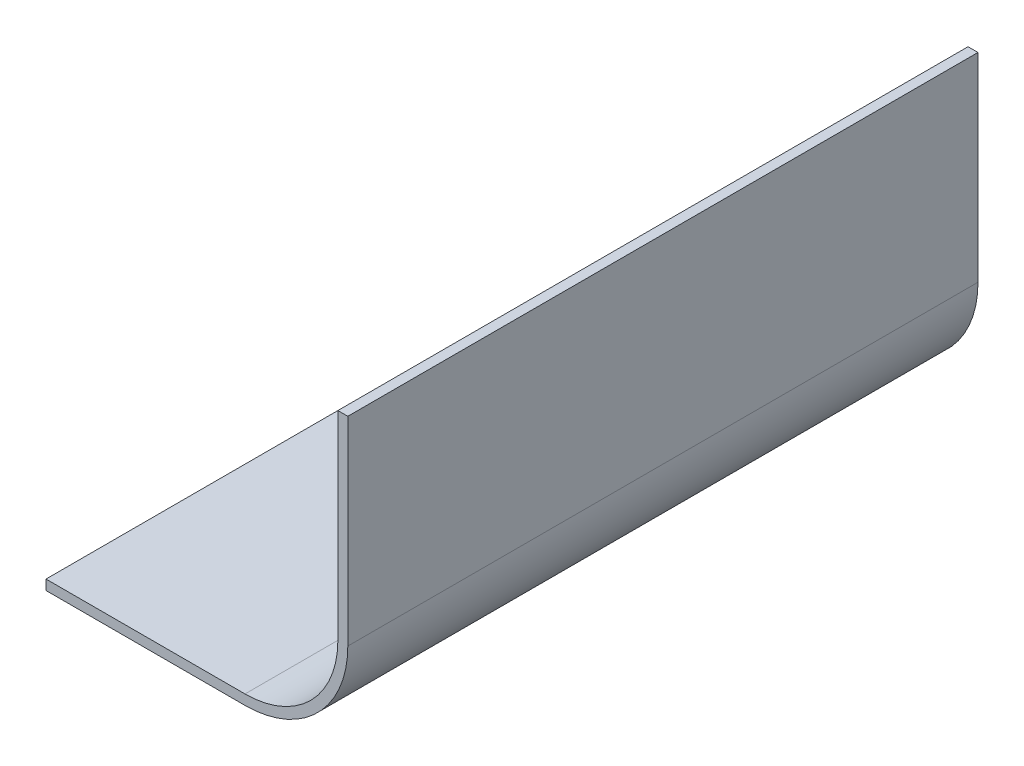
ISO-10303-21;
HEADER;
FILE_DESCRIPTION(('STEP AP214'),'2;1');
FILE_NAME('part.step','',(''),(''),'','','');
FILE_SCHEMA(('AUTOMOTIVE_DESIGN { 1 0 10303 214 1 1 1 1 }'));
ENDSEC;
DATA;
#1=APPLICATION_CONTEXT('core data for automotive mechanical design processes');
#2=APPLICATION_PROTOCOL_DEFINITION('international standard','automotive_design',2000,#1);
#3=PRODUCT_CONTEXT('',#1,'mechanical');
#4=PRODUCT('Part','Part','',(#3));
#5=PRODUCT_RELATED_PRODUCT_CATEGORY('part','',(#4));
#6=PRODUCT_DEFINITION_FORMATION('','',#4);
#7=PRODUCT_DEFINITION_CONTEXT('part definition',#1,'design');
#8=PRODUCT_DEFINITION('design','',#6,#7);
#9=PRODUCT_DEFINITION_SHAPE('','',#8);
#10=(LENGTH_UNIT() NAMED_UNIT(*) SI_UNIT(.MILLI.,.METRE.));
#11=(NAMED_UNIT(*) PLANE_ANGLE_UNIT() SI_UNIT($,.RADIAN.));
#12=(NAMED_UNIT(*) SI_UNIT($,.STERADIAN.) SOLID_ANGLE_UNIT());
#13=UNCERTAINTY_MEASURE_WITH_UNIT(LENGTH_MEASURE(1.E-05),#10,'distance_accuracy_value','');
#14=(GEOMETRIC_REPRESENTATION_CONTEXT(3) GLOBAL_UNCERTAINTY_ASSIGNED_CONTEXT((#13)) GLOBAL_UNIT_ASSIGNED_CONTEXT((#10,
#11,#12)) REPRESENTATION_CONTEXT('',''));
#15=CARTESIAN_POINT('',(0.,0.,0.));
#16=DIRECTION('',(0.,0.,1.));
#17=DIRECTION('',(1.,0.,0.));
#18=AXIS2_PLACEMENT_3D('',#15,#16,#17);
#19=CARTESIAN_POINT('',(318.230095586367,329.772792200192,279.007812812781));
#20=DIRECTION('',(0.,-1.,0.));
#21=DIRECTION('',(0.,0.,0.999999999999999));
#22=AXIS2_PLACEMENT_3D('',#19,#20,#21);
#23=PLANE('',#22);
#24=DIRECTION('',(0.,0.,0.999999999999999));
#25=VECTOR('',#24,1.);
#26=CARTESIAN_POINT('',(318.230095586367,329.772792200192,279.007812812781));
#27=LINE('',#26,#25);
#28=CARTESIAN_POINT('',(318.230095586367,329.772792200191,285.00781281278));
#29=VERTEX_POINT('',#28);
#30=CARTESIAN_POINT('',(318.230095586367,329.772792200191,475.00781281278));
#31=VERTEX_POINT('',#30);
#32=EDGE_CURVE('E227',#29,#31,#27,.T.);
#33=ORIENTED_EDGE('',*,*,#32,.F.);
#34=DIRECTION('',(-0.999999999999998,0.,0.));
#35=VECTOR('',#34,1.);
#36=CARTESIAN_POINT('',(227.230095586367,329.772792200192,285.007812812782));
#37=LINE('',#36,#35);
#38=CARTESIAN_POINT('',(315.230095586367,329.772792200191,285.00781281278));
#39=VERTEX_POINT('',#38);
#40=EDGE_CURVE('E409',#29,#39,#37,.T.);
#41=ORIENTED_EDGE('',*,*,#40,.T.);
#42=DIRECTION('',(0.,0.,0.999999999999999));
#43=VECTOR('',#42,1.);
#44=CARTESIAN_POINT('',(315.230095586366,329.772792200192,279.007812812781));
#45=LINE('',#44,#43);
#46=CARTESIAN_POINT('',(315.230095586367,329.772792200192,475.00781281278));
#47=VERTEX_POINT('',#46);
#48=EDGE_CURVE('E245',#39,#47,#45,.T.);
#49=ORIENTED_EDGE('',*,*,#48,.T.);
#50=DIRECTION('',(-0.999999999999998,0.,0.));
#51=VECTOR('',#50,1.);
#52=CARTESIAN_POINT('',(318.230095586367,329.772792200191,475.00781281278));
#53=LINE('',#52,#51);
#54=EDGE_CURVE('E243',#31,#47,#53,.T.);
#55=ORIENTED_EDGE('',*,*,#54,.F.);
#56=EDGE_LOOP('',(#33,#41,#49,#55));
#57=FACE_BOUND('',#56,.T.);
#58=ADVANCED_FACE('F185',(#57),#23,.F.);
#59=CARTESIAN_POINT('',(287.230095586367,241.772792200192,279.007812812781));
#60=DIRECTION('',(0.,1.,0.));
#61=DIRECTION('',(0.,0.,0.999999999999999));
#62=AXIS2_PLACEMENT_3D('',#59,#60,#61);
#63=PLANE('',#62);
#64=DIRECTION('',(0.,0.,0.999999999999999));
#65=VECTOR('',#64,1.);
#66=CARTESIAN_POINT('',(287.230095586367,241.772792200192,279.007812812781));
#67=LINE('',#66,#65);
#68=CARTESIAN_POINT('',(287.230095586367,241.772792200192,285.007812812781));
#69=VERTEX_POINT('',#68);
#70=CARTESIAN_POINT('',(287.230095586367,241.772792200191,475.007812812781));
#71=VERTEX_POINT('',#70);
#72=EDGE_CURVE('E208',#69,#71,#67,.T.);
#73=ORIENTED_EDGE('',*,*,#72,.F.);
#74=DIRECTION('',(-0.999999999999998,0.,0.));
#75=VECTOR('',#74,1.);
#76=CARTESIAN_POINT('',(287.230095586367,241.772792200192,285.007812812781));
#77=LINE('',#76,#75);
#78=CARTESIAN_POINT('',(227.230095586367,241.772792200193,285.007812812781));
#79=VERTEX_POINT('',#78);
#80=EDGE_CURVE('E319',#69,#79,#77,.T.);
#81=ORIENTED_EDGE('',*,*,#80,.T.);
#82=DIRECTION('',(0.,0.,-0.999999999999999));
#83=VECTOR('',#82,1.);
#84=CARTESIAN_POINT('',(227.230095586367,241.772792200193,279.007812812781));
#85=LINE('',#84,#83);
#86=CARTESIAN_POINT('',(227.230095586367,241.772792200192,475.007812812781));
#87=VERTEX_POINT('',#86);
#88=EDGE_CURVE('E253',#87,#79,#85,.T.);
#89=ORIENTED_EDGE('',*,*,#88,.F.);
#90=DIRECTION('',(0.999999999999998,0.,0.));
#91=VECTOR('',#90,1.);
#92=CARTESIAN_POINT('',(287.230095586367,241.772792200191,475.007812812781));
#93=LINE('',#92,#91);
#94=EDGE_CURVE('E277',#71,#87,#93,.F.);
#95=ORIENTED_EDGE('',*,*,#94,.F.);
#96=EDGE_LOOP('',(#73,#81,#89,#95));
#97=FACE_BOUND('',#96,.T.);
#98=ADVANCED_FACE('F326',(#97),#63,.T.);
#99=CARTESIAN_POINT('',(287.230095586367,269.772792200192,279.007812812781));
#100=DIRECTION('',(0.,0.,0.999999999999999));
#101=DIRECTION('',(0.999999999999998,0.,0.));
#102=AXIS2_PLACEMENT_3D('',#99,#100,#101);
#103=CYLINDRICAL_SURFACE('',#102,28.);
#104=DIRECTION('',(0.,0.,0.999999999999999));
#105=VECTOR('',#104,1.);
#106=CARTESIAN_POINT('',(315.230095586367,269.772792200192,279.007812812781));
#107=LINE('',#106,#105);
#108=CARTESIAN_POINT('',(315.230095586367,269.772792200192,285.007812812781));
#109=VERTEX_POINT('',#108);
#110=CARTESIAN_POINT('',(315.230095586366,269.772792200191,475.007812812781));
#111=VERTEX_POINT('',#110);
#112=EDGE_CURVE('E285',#109,#111,#107,.T.);
#113=ORIENTED_EDGE('',*,*,#112,.F.);
#114=CARTESIAN_POINT('',(287.230095586366,269.772792200192,285.007812812781));
#115=DIRECTION('',(0.,0.,-0.999999999999999));
#116=DIRECTION('',(-0.999999999999998,0.,0.));
#117=AXIS2_PLACEMENT_3D('',#114,#115,#116);
#118=CIRCLE('',#117,28.);
#119=EDGE_CURVE('E315',#109,#69,#118,.T.);
#120=ORIENTED_EDGE('',*,*,#119,.T.);
#121=ORIENTED_EDGE('',*,*,#72,.T.);
#122=CARTESIAN_POINT('',(287.230095586367,269.772792200191,475.00781281278));
#123=DIRECTION('',(0.,0.,0.999999999999999));
#124=DIRECTION('',(0.999999999999998,0.,0.));
#125=AXIS2_PLACEMENT_3D('',#122,#123,#124);
#126=CIRCLE('',#125,28.);
#127=EDGE_CURVE('E290',#71,#111,#126,.T.);
#128=ORIENTED_EDGE('',*,*,#127,.T.);
#129=EDGE_LOOP('',(#113,#120,#121,#128));
#130=FACE_BOUND('',#129,.T.);
#131=ADVANCED_FACE('F324',(#130),#103,.F.);
#132=CARTESIAN_POINT('',(315.230095586367,269.772792200192,279.007812812781));
#133=DIRECTION('',(-0.999999999999998,0.,0.));
#134=DIRECTION('',(0.,0.,0.999999999999999));
#135=AXIS2_PLACEMENT_3D('',#132,#133,#134);
#136=PLANE('',#135);
#137=ORIENTED_EDGE('',*,*,#48,.F.);
#138=DIRECTION('',(0.,-1.,0.));
#139=VECTOR('',#138,1.);
#140=CARTESIAN_POINT('',(315.230095586367,269.772792200192,285.007812812781));
#141=LINE('',#140,#139);
#142=EDGE_CURVE('E280',#39,#109,#141,.T.);
#143=ORIENTED_EDGE('',*,*,#142,.T.);
#144=ORIENTED_EDGE('',*,*,#112,.T.);
#145=DIRECTION('',(0.,1.,0.));
#146=VECTOR('',#145,1.);
#147=CARTESIAN_POINT('',(315.230095586366,269.772792200191,475.007812812781));
#148=LINE('',#147,#146);
#149=EDGE_CURVE('E288',#111,#47,#148,.T.);
#150=ORIENTED_EDGE('',*,*,#149,.T.);
#151=EDGE_LOOP('',(#137,#143,#144,#150));
#152=FACE_BOUND('',#151,.T.);
#153=ADVANCED_FACE('F323',(#152),#136,.T.);
#154=CARTESIAN_POINT('',(287.230095586367,238.772792200192,279.007812812781));
#155=DIRECTION('',(0.,1.,0.));
#156=DIRECTION('',(0.,0.,0.999999999999999));
#157=AXIS2_PLACEMENT_3D('',#154,#155,#156);
#158=PLANE('',#157);
#159=DIRECTION('',(-0.999999999999998,0.,0.));
#160=VECTOR('',#159,1.);
#161=CARTESIAN_POINT('',(227.230095586367,238.772792200192,285.007812812781));
#162=LINE('',#161,#160);
#163=CARTESIAN_POINT('',(287.230095586367,238.772792200192,285.007812812782));
#164=VERTEX_POINT('',#163);
#165=CARTESIAN_POINT('',(227.230095586367,238.772792200193,285.007812812781));
#166=VERTEX_POINT('',#165);
#167=EDGE_CURVE('E199',#164,#166,#162,.T.);
#168=ORIENTED_EDGE('',*,*,#167,.F.);
#169=DIRECTION('',(0.,0.,0.999999999999999));
#170=VECTOR('',#169,1.);
#171=CARTESIAN_POINT('',(287.230095586367,238.772792200192,377.007812812781));
#172=LINE('',#171,#170);
#173=CARTESIAN_POINT('',(287.230095586367,238.772792200191,475.007812812781));
#174=VERTEX_POINT('',#173);
#175=EDGE_CURVE('E292',#164,#174,#172,.T.);
#176=ORIENTED_EDGE('',*,*,#175,.T.);
#177=DIRECTION('',(-0.999999999999998,0.,0.));
#178=VECTOR('',#177,1.);
#179=CARTESIAN_POINT('',(227.230095586367,238.772792200192,475.007812812781));
#180=LINE('',#179,#178);
#181=CARTESIAN_POINT('',(227.230095586367,238.772792200192,475.007812812781));
#182=VERTEX_POINT('',#181);
#183=EDGE_CURVE('E268',#174,#182,#180,.T.);
#184=ORIENTED_EDGE('',*,*,#183,.T.);
#185=DIRECTION('',(0.,0.,-0.999999999999999));
#186=VECTOR('',#185,1.);
#187=CARTESIAN_POINT('',(227.230095586367,238.772792200193,279.007812812781));
#188=LINE('',#187,#186);
#189=EDGE_CURVE('E193',#182,#166,#188,.T.);
#190=ORIENTED_EDGE('',*,*,#189,.T.);
#191=EDGE_LOOP('',(#168,#176,#184,#190));
#192=FACE_BOUND('',#191,.T.);
#193=ADVANCED_FACE('F265',(#192),#158,.F.);
#194=CARTESIAN_POINT('',(287.230095586367,269.772792200192,279.007812812781));
#195=DIRECTION('',(0.,0.,0.999999999999999));
#196=DIRECTION('',(0.999999999999998,0.,0.));
#197=AXIS2_PLACEMENT_3D('',#194,#195,#196);
#198=CYLINDRICAL_SURFACE('',#197,31.);
#199=CARTESIAN_POINT('',(287.230095586366,269.772792200192,285.007812812781));
#200=DIRECTION('',(0.,0.,-0.999999999999999));
#201=DIRECTION('',(-0.999999999999998,0.,0.));
#202=AXIS2_PLACEMENT_3D('',#199,#200,#201);
#203=CIRCLE('',#202,31.);
#204=CARTESIAN_POINT('',(318.230095586367,269.772792200192,285.007812812781));
#205=VERTEX_POINT('',#204);
#206=EDGE_CURVE('E278',#205,#164,#203,.T.);
#207=ORIENTED_EDGE('',*,*,#206,.F.);
#208=DIRECTION('',(0.,0.,0.999999999999999));
#209=VECTOR('',#208,1.);
#210=CARTESIAN_POINT('',(318.230095586367,269.772792200192,279.007812812781));
#211=LINE('',#210,#209);
#212=CARTESIAN_POINT('',(318.230095586367,269.772792200191,475.00781281278));
#213=VERTEX_POINT('',#212);
#214=EDGE_CURVE('E240',#205,#213,#211,.T.);
#215=ORIENTED_EDGE('',*,*,#214,.T.);
#216=CARTESIAN_POINT('',(287.230095586367,269.772792200191,475.00781281278));
#217=DIRECTION('',(0.,0.,0.999999999999999));
#218=DIRECTION('',(-0.999999999999998,0.,0.));
#219=AXIS2_PLACEMENT_3D('',#216,#217,#218);
#220=CIRCLE('',#219,31.);
#221=EDGE_CURVE('E239',#174,#213,#220,.T.);
#222=ORIENTED_EDGE('',*,*,#221,.F.);
#223=ORIENTED_EDGE('',*,*,#175,.F.);
#224=EDGE_LOOP('',(#207,#215,#222,#223));
#225=FACE_BOUND('',#224,.T.);
#226=ADVANCED_FACE('F297',(#225),#198,.T.);
#227=CARTESIAN_POINT('',(318.230095586367,269.772792200192,279.007812812781));
#228=DIRECTION('',(-0.999999999999998,0.,0.));
#229=DIRECTION('',(0.,0.,0.999999999999999));
#230=AXIS2_PLACEMENT_3D('',#227,#228,#229);
#231=PLANE('',#230);
#232=DIRECTION('',(0.,-1.,0.));
#233=VECTOR('',#232,1.);
#234=CARTESIAN_POINT('',(318.230095586367,-1.66533453693773E-13,285.007812812782));
#235=LINE('',#234,#233);
#236=EDGE_CURVE('E236',#29,#205,#235,.T.);
#237=ORIENTED_EDGE('',*,*,#236,.F.);
#238=ORIENTED_EDGE('',*,*,#32,.T.);
#239=DIRECTION('',(0.,1.,0.));
#240=VECTOR('',#239,1.);
#241=CARTESIAN_POINT('',(318.230095586367,269.772792200191,475.00781281278));
#242=LINE('',#241,#240);
#243=EDGE_CURVE('E232',#213,#31,#242,.T.);
#244=ORIENTED_EDGE('',*,*,#243,.F.);
#245=ORIENTED_EDGE('',*,*,#214,.F.);
#246=EDGE_LOOP('',(#237,#238,#244,#245));
#247=FACE_BOUND('',#246,.T.);
#248=ADVANCED_FACE('F229',(#247),#231,.F.);
#249=CARTESIAN_POINT('',(227.230095586367,238.772792200192,279.007812812781));
#250=DIRECTION('',(0.999999999999998,0.,0.));
#251=DIRECTION('',(0.,0.,-0.999999999999999));
#252=AXIS2_PLACEMENT_3D('',#249,#250,#251);
#253=PLANE('',#252);
#254=DIRECTION('',(0.,1.,0.));
#255=VECTOR('',#254,1.);
#256=CARTESIAN_POINT('',(227.230095586367,238.772792200192,285.007812812781));
#257=LINE('',#256,#255);
#258=EDGE_CURVE('E13',#166,#79,#257,.T.);
#259=ORIENTED_EDGE('',*,*,#258,.F.);
#260=ORIENTED_EDGE('',*,*,#189,.F.);
#261=DIRECTION('',(0.,-1.,0.));
#262=VECTOR('',#261,1.);
#263=CARTESIAN_POINT('',(227.230095586367,238.772792200192,475.007812812781));
#264=LINE('',#263,#262);
#265=EDGE_CURVE('E257',#87,#182,#264,.T.);
#266=ORIENTED_EDGE('',*,*,#265,.F.);
#267=ORIENTED_EDGE('',*,*,#88,.T.);
#268=EDGE_LOOP('',(#259,#260,#266,#267));
#269=FACE_BOUND('',#268,.T.);
#270=ADVANCED_FACE('F271',(#269),#253,.F.);
#271=CARTESIAN_POINT('',(167.230095586367,269.772792200191,475.007812812781));
#272=DIRECTION('',(0.,0.,-0.999999999999999));
#273=DIRECTION('',(-0.999999999999998,0.,0.));
#274=AXIS2_PLACEMENT_3D('',#271,#272,#273);
#275=PLANE('',#274);
#276=ORIENTED_EDGE('',*,*,#265,.T.);
#277=ORIENTED_EDGE('',*,*,#183,.F.);
#278=ORIENTED_EDGE('',*,*,#221,.T.);
#279=ORIENTED_EDGE('',*,*,#243,.T.);
#280=ORIENTED_EDGE('',*,*,#54,.T.);
#281=ORIENTED_EDGE('',*,*,#149,.F.);
#282=ORIENTED_EDGE('',*,*,#127,.F.);
#283=ORIENTED_EDGE('',*,*,#94,.T.);
#284=EDGE_LOOP('',(#276,#277,#278,#279,#280,#281,#282,#283));
#285=FACE_BOUND('',#284,.T.);
#286=ADVANCED_FACE('F187',(#285),#275,.F.);
#287=CARTESIAN_POINT('',(227.230095586367,1.66533453693773E-13,285.007812812782));
#288=DIRECTION('',(0.,0.,-0.999999999999999));
#289=DIRECTION('',(-0.999999999999998,0.,0.));
#290=AXIS2_PLACEMENT_3D('',#287,#288,#289);
#291=PLANE('',#290);
#292=ORIENTED_EDGE('',*,*,#206,.T.);
#293=ORIENTED_EDGE('',*,*,#167,.T.);
#294=ORIENTED_EDGE('',*,*,#258,.T.);
#295=ORIENTED_EDGE('',*,*,#80,.F.);
#296=ORIENTED_EDGE('',*,*,#119,.F.);
#297=ORIENTED_EDGE('',*,*,#142,.F.);
#298=ORIENTED_EDGE('',*,*,#40,.F.);
#299=ORIENTED_EDGE('',*,*,#236,.T.);
#300=EDGE_LOOP('',(#292,#293,#294,#295,#296,#297,#298,#299));
#301=FACE_BOUND('',#300,.T.);
#302=ADVANCED_FACE('F317',(#301),#291,.T.);
#303=CLOSED_SHELL('',(#58,#98,#131,#153,#193,#226,#248,#270,#286,#302));
#304=MANIFOLD_SOLID_BREP('B2',#303);
#305=ADVANCED_BREP_SHAPE_REPRESENTATION('',(#18,#304),#14);
#306=SHAPE_DEFINITION_REPRESENTATION(#9,#305);
ENDSEC;
END-ISO-10303-21;
